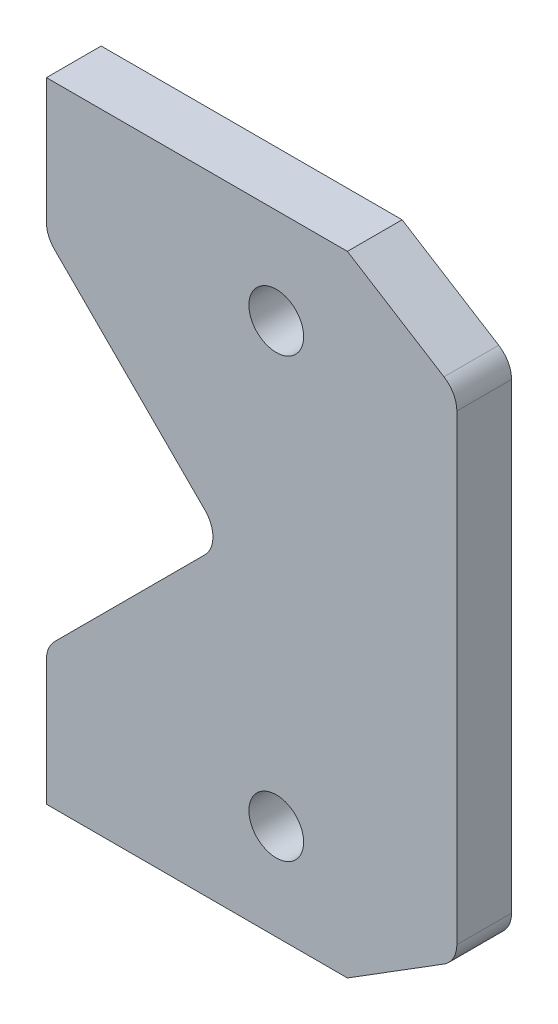
ISO-10303-21;
HEADER;
FILE_DESCRIPTION(('STEP AP214'),'2;1');
FILE_NAME('part.step','',(''),(''),'','','');
FILE_SCHEMA(('AUTOMOTIVE_DESIGN { 1 0 10303 214 1 1 1 1 }'));
ENDSEC;
DATA;
#1=APPLICATION_CONTEXT('core data for automotive mechanical design processes');
#2=APPLICATION_PROTOCOL_DEFINITION('international standard','automotive_design',2000,#1);
#3=PRODUCT_CONTEXT('',#1,'mechanical');
#4=PRODUCT('Part','Part','',(#3));
#5=PRODUCT_RELATED_PRODUCT_CATEGORY('part','',(#4));
#6=PRODUCT_DEFINITION_FORMATION('','',#4);
#7=PRODUCT_DEFINITION_CONTEXT('part definition',#1,'design');
#8=PRODUCT_DEFINITION('design','',#6,#7);
#9=PRODUCT_DEFINITION_SHAPE('','',#8);
#10=(LENGTH_UNIT() NAMED_UNIT(*) SI_UNIT(.MILLI.,.METRE.));
#11=(NAMED_UNIT(*) PLANE_ANGLE_UNIT() SI_UNIT($,.RADIAN.));
#12=(NAMED_UNIT(*) SI_UNIT($,.STERADIAN.) SOLID_ANGLE_UNIT());
#13=UNCERTAINTY_MEASURE_WITH_UNIT(LENGTH_MEASURE(1.E-05),#10,'distance_accuracy_value','');
#14=(GEOMETRIC_REPRESENTATION_CONTEXT(3) GLOBAL_UNCERTAINTY_ASSIGNED_CONTEXT((#13)) GLOBAL_UNIT_ASSIGNED_CONTEXT((#10,
#11,#12)) REPRESENTATION_CONTEXT('',''));
#15=CARTESIAN_POINT('',(0.,0.,0.));
#16=DIRECTION('',(0.,0.,1.));
#17=DIRECTION('',(1.,0.,0.));
#18=AXIS2_PLACEMENT_3D('',#15,#16,#17);
#19=CARTESIAN_POINT('',(0.,0.,10.));
#20=DIRECTION('',(0.,0.,1.));
#21=DIRECTION('',(1.,0.,0.));
#22=AXIS2_PLACEMENT_3D('',#19,#20,#21);
#23=PLANE('',#22);
#24=CARTESIAN_POINT('',(4.5,40.,10.));
#25=DIRECTION('',(0.,0.,1.));
#26=DIRECTION('',(1.,0.,0.));
#27=AXIS2_PLACEMENT_3D('',#24,#25,#26);
#28=CIRCLE('',#27,5.);
#29=CARTESIAN_POINT('',(9.50000000000001,40.,10.));
#30=VERTEX_POINT('',#29);
#31=EDGE_CURVE('E313',#30,#30,#28,.T.);
#32=ORIENTED_EDGE('',*,*,#31,.F.);
#33=EDGE_LOOP('',(#32));
#34=FACE_BOUND('',#33,.T.);
#35=DIRECTION('',(0.847998304005088,0.52999894000318,0.));
#36=VECTOR('',#35,1.);
#37=CARTESIAN_POINT('',(30.7584269662921,-49.2134831460674,10.));
#38=LINE('',#37,#36);
#39=CARTESIAN_POINT('',(17.5,-57.5,10.));
#40=VERTEX_POINT('',#39);
#41=CARTESIAN_POINT('',(35.1499947000159,-46.4687533124901,10.));
#42=VERTEX_POINT('',#41);
#43=EDGE_CURVE('E159',#40,#42,#38,.T.);
#44=ORIENTED_EDGE('',*,*,#43,.T.);
#45=CARTESIAN_POINT('',(32.5,-42.2287617924646,10.));
#46=DIRECTION('',(0.,0.,1.));
#47=DIRECTION('',(1.,0.,0.));
#48=AXIS2_PLACEMENT_3D('',#45,#46,#47);
#49=CIRCLE('',#48,5.);
#50=CARTESIAN_POINT('',(37.5,-42.2287617924646,10.));
#51=VERTEX_POINT('',#50);
#52=EDGE_CURVE('E226',#42,#51,#49,.T.);
#53=ORIENTED_EDGE('',*,*,#52,.T.);
#54=DIRECTION('',(0.,-1.,0.));
#55=VECTOR('',#54,1.);
#56=CARTESIAN_POINT('',(37.5,0.,10.));
#57=LINE('',#56,#55);
#58=CARTESIAN_POINT('',(37.5,42.2287617924646,10.));
#59=VERTEX_POINT('',#58);
#60=EDGE_CURVE('E248',#59,#51,#57,.T.);
#61=ORIENTED_EDGE('',*,*,#60,.F.);
#62=CARTESIAN_POINT('',(32.5,42.2287617924646,10.));
#63=DIRECTION('',(0.,0.,1.));
#64=DIRECTION('',(1.,0.,0.));
#65=AXIS2_PLACEMENT_3D('',#62,#63,#64);
#66=CIRCLE('',#65,5.);
#67=CARTESIAN_POINT('',(35.1499947000159,46.4687533124901,10.));
#68=VERTEX_POINT('',#67);
#69=EDGE_CURVE('E224',#59,#68,#66,.T.);
#70=ORIENTED_EDGE('',*,*,#69,.T.);
#71=DIRECTION('',(0.847998304005088,-0.52999894000318,0.));
#72=VECTOR('',#71,1.);
#73=CARTESIAN_POINT('',(30.7584269662921,49.2134831460674,10.));
#74=LINE('',#73,#72);
#75=CARTESIAN_POINT('',(17.5,57.5,10.));
#76=VERTEX_POINT('',#75);
#77=EDGE_CURVE('E252',#76,#68,#74,.T.);
#78=ORIENTED_EDGE('',*,*,#77,.F.);
#79=DIRECTION('',(1.,0.,0.));
#80=VECTOR('',#79,1.);
#81=CARTESIAN_POINT('',(0.,57.5,10.));
#82=LINE('',#81,#80);
#83=CARTESIAN_POINT('',(-37.5,57.5,10.));
#84=VERTEX_POINT('',#83);
#85=EDGE_CURVE('E167',#84,#76,#82,.T.);
#86=ORIENTED_EDGE('',*,*,#85,.F.);
#87=DIRECTION('',(0.,-1.,0.));
#88=VECTOR('',#87,1.);
#89=CARTESIAN_POINT('',(-37.5,0.,10.));
#90=LINE('',#89,#88);
#91=CARTESIAN_POINT('',(-37.5,34.5710678118656,10.));
#92=VERTEX_POINT('',#91);
#93=EDGE_CURVE('E267',#84,#92,#90,.T.);
#94=ORIENTED_EDGE('',*,*,#93,.T.);
#95=CARTESIAN_POINT('',(-32.5,34.5710678118656,10.));
#96=DIRECTION('',(0.,0.,1.));
#97=DIRECTION('',(1.,0.,0.));
#98=AXIS2_PLACEMENT_3D('',#95,#96,#97);
#99=CIRCLE('',#98,5.);
#100=CARTESIAN_POINT('',(-36.0355339059326,31.0355339059327,10.));
#101=VERTEX_POINT('',#100);
#102=EDGE_CURVE('E206',#92,#101,#99,.T.);
#103=ORIENTED_EDGE('',*,*,#102,.T.);
#104=DIRECTION('',(0.707106781186578,-0.707106781186517,0.));
#105=VECTOR('',#104,1.);
#106=CARTESIAN_POINT('',(-2.49999999999839,-2.4999999999986,10.));
#107=LINE('',#106,#105);
#108=CARTESIAN_POINT('',(-8.53553390592969,3.53553390593217,10.));
#109=VERTEX_POINT('',#108);
#110=EDGE_CURVE('E191',#101,#109,#107,.T.);
#111=ORIENTED_EDGE('',*,*,#110,.T.);
#112=CARTESIAN_POINT('',(-12.0710678118623,-7.13838710364456E-13,10.));
#113=DIRECTION('',(0.,0.,1.));
#114=DIRECTION('',(1.,0.,0.));
#115=AXIS2_PLACEMENT_3D('',#112,#113,#114);
#116=CIRCLE('',#115,5.);
#117=CARTESIAN_POINT('',(-8.53553390592978,-3.53553390593369,10.));
#118=VERTEX_POINT('',#117);
#119=EDGE_CURVE('E219',#109,#118,#116,.F.);
#120=ORIENTED_EDGE('',*,*,#119,.T.);
#121=DIRECTION('',(0.707106781186595,0.7071067811865,0.));
#122=VECTOR('',#121,1.);
#123=CARTESIAN_POINT('',(-2.49999999999746,2.4999999999978,10.));
#124=LINE('',#123,#122);
#125=CARTESIAN_POINT('',(-36.0355339059325,-31.0355339059327,10.));
#126=VERTEX_POINT('',#125);
#127=EDGE_CURVE('E187',#126,#118,#124,.T.);
#128=ORIENTED_EDGE('',*,*,#127,.F.);
#129=CARTESIAN_POINT('',(-32.5,-34.5710678118657,10.));
#130=DIRECTION('',(0.,0.,1.));
#131=DIRECTION('',(1.,0.,0.));
#132=AXIS2_PLACEMENT_3D('',#129,#130,#131);
#133=CIRCLE('',#132,5.);
#134=CARTESIAN_POINT('',(-37.5,-34.5710678118657,10.));
#135=VERTEX_POINT('',#134);
#136=EDGE_CURVE('E208',#126,#135,#133,.T.);
#137=ORIENTED_EDGE('',*,*,#136,.T.);
#138=DIRECTION('',(0.,-1.,0.));
#139=VECTOR('',#138,1.);
#140=CARTESIAN_POINT('',(-37.5,0.,10.));
#141=LINE('',#140,#139);
#142=CARTESIAN_POINT('',(-37.5,-57.5,10.));
#143=VERTEX_POINT('',#142);
#144=EDGE_CURVE('E262',#135,#143,#141,.T.);
#145=ORIENTED_EDGE('',*,*,#144,.T.);
#146=DIRECTION('',(1.,0.,0.));
#147=VECTOR('',#146,1.);
#148=CARTESIAN_POINT('',(0.,-57.5,10.));
#149=LINE('',#148,#147);
#150=EDGE_CURVE('E264',#143,#40,#149,.T.);
#151=ORIENTED_EDGE('',*,*,#150,.T.);
#152=EDGE_LOOP('',(#44,#53,#61,#70,#78,#86,#94,#103,#111,#120,#128,#137,#145,#151));
#153=FACE_BOUND('',#152,.T.);
#154=CARTESIAN_POINT('',(4.5,-40.,10.));
#155=DIRECTION('',(0.,0.,1.));
#156=DIRECTION('',(1.,0.,0.));
#157=AXIS2_PLACEMENT_3D('',#154,#155,#156);
#158=CIRCLE('',#157,5.);
#159=CARTESIAN_POINT('',(9.50000000000001,-40.,10.));
#160=VERTEX_POINT('',#159);
#161=EDGE_CURVE('E316',#160,#160,#158,.F.);
#162=ORIENTED_EDGE('',*,*,#161,.T.);
#163=EDGE_LOOP('',(#162));
#164=FACE_BOUND('',#163,.T.);
#165=ADVANCED_FACE('F51',(#34,#153,#164),#23,.T.);
#166=CARTESIAN_POINT('',(0.,0.,0.));
#167=DIRECTION('',(0.,0.,1.));
#168=DIRECTION('',(1.,0.,0.));
#169=AXIS2_PLACEMENT_3D('',#166,#167,#168);
#170=PLANE('',#169);
#171=CARTESIAN_POINT('',(4.5,40.,0.));
#172=DIRECTION('',(0.,0.,1.));
#173=DIRECTION('',(1.,0.,0.));
#174=AXIS2_PLACEMENT_3D('',#171,#172,#173);
#175=CIRCLE('',#174,5.);
#176=CARTESIAN_POINT('',(9.50000000000001,40.,0.));
#177=VERTEX_POINT('',#176);
#178=EDGE_CURVE('E310',#177,#177,#175,.T.);
#179=ORIENTED_EDGE('',*,*,#178,.T.);
#180=EDGE_LOOP('',(#179));
#181=FACE_BOUND('',#180,.T.);
#182=DIRECTION('',(0.,-1.,0.));
#183=VECTOR('',#182,1.);
#184=CARTESIAN_POINT('',(37.5,0.,0.));
#185=LINE('',#184,#183);
#186=CARTESIAN_POINT('',(37.5,42.2287617924646,0.));
#187=VERTEX_POINT('',#186);
#188=CARTESIAN_POINT('',(37.5,-42.2287617924646,0.));
#189=VERTEX_POINT('',#188);
#190=EDGE_CURVE('E158',#187,#189,#185,.T.);
#191=ORIENTED_EDGE('',*,*,#190,.T.);
#192=CARTESIAN_POINT('',(32.5,-42.2287617924646,0.));
#193=DIRECTION('',(0.,0.,1.));
#194=DIRECTION('',(1.,0.,0.));
#195=AXIS2_PLACEMENT_3D('',#192,#193,#194);
#196=CIRCLE('',#195,5.);
#197=CARTESIAN_POINT('',(35.1499947000159,-46.4687533124901,0.));
#198=VERTEX_POINT('',#197);
#199=EDGE_CURVE('E59',#189,#198,#196,.F.);
#200=ORIENTED_EDGE('',*,*,#199,.T.);
#201=DIRECTION('',(0.847998304005088,0.52999894000318,0.));
#202=VECTOR('',#201,1.);
#203=CARTESIAN_POINT('',(30.7584269662921,-49.2134831460674,0.));
#204=LINE('',#203,#202);
#205=CARTESIAN_POINT('',(17.5,-57.5,0.));
#206=VERTEX_POINT('',#205);
#207=EDGE_CURVE('E169',#206,#198,#204,.T.);
#208=ORIENTED_EDGE('',*,*,#207,.F.);
#209=DIRECTION('',(1.,0.,0.));
#210=VECTOR('',#209,1.);
#211=CARTESIAN_POINT('',(0.,-57.5,0.));
#212=LINE('',#211,#210);
#213=CARTESIAN_POINT('',(-37.5,-57.5,0.));
#214=VERTEX_POINT('',#213);
#215=EDGE_CURVE('E176',#214,#206,#212,.T.);
#216=ORIENTED_EDGE('',*,*,#215,.F.);
#217=DIRECTION('',(0.,-1.,0.));
#218=VECTOR('',#217,1.);
#219=CARTESIAN_POINT('',(-37.5,0.,0.));
#220=LINE('',#219,#218);
#221=CARTESIAN_POINT('',(-37.5,-34.5710678118657,0.));
#222=VERTEX_POINT('',#221);
#223=EDGE_CURVE('E181',#222,#214,#220,.T.);
#224=ORIENTED_EDGE('',*,*,#223,.F.);
#225=CARTESIAN_POINT('',(-32.5,-34.5710678118657,0.));
#226=DIRECTION('',(0.,0.,1.));
#227=DIRECTION('',(1.,0.,0.));
#228=AXIS2_PLACEMENT_3D('',#225,#226,#227);
#229=CIRCLE('',#228,5.);
#230=CARTESIAN_POINT('',(-36.0355339059325,-31.0355339059327,0.));
#231=VERTEX_POINT('',#230);
#232=EDGE_CURVE('E199',#222,#231,#229,.F.);
#233=ORIENTED_EDGE('',*,*,#232,.T.);
#234=DIRECTION('',(0.707106781186595,0.7071067811865,0.));
#235=VECTOR('',#234,1.);
#236=CARTESIAN_POINT('',(-2.49999999999746,2.4999999999978,0.));
#237=LINE('',#236,#235);
#238=CARTESIAN_POINT('',(-8.53553390592978,-3.53553390593369,0.));
#239=VERTEX_POINT('',#238);
#240=EDGE_CURVE('E258',#231,#239,#237,.T.);
#241=ORIENTED_EDGE('',*,*,#240,.T.);
#242=CARTESIAN_POINT('',(-12.0710678118623,-7.13838710364456E-13,0.));
#243=DIRECTION('',(0.,0.,1.));
#244=DIRECTION('',(1.,0.,0.));
#245=AXIS2_PLACEMENT_3D('',#242,#243,#244);
#246=CIRCLE('',#245,5.);
#247=CARTESIAN_POINT('',(-8.53553390592969,3.53553390593217,0.));
#248=VERTEX_POINT('',#247);
#249=EDGE_CURVE('E217',#239,#248,#246,.T.);
#250=ORIENTED_EDGE('',*,*,#249,.T.);
#251=DIRECTION('',(0.707106781186578,-0.707106781186517,0.));
#252=VECTOR('',#251,1.);
#253=CARTESIAN_POINT('',(-2.49999999999839,-2.4999999999986,0.));
#254=LINE('',#253,#252);
#255=CARTESIAN_POINT('',(-36.0355339059326,31.0355339059327,0.));
#256=VERTEX_POINT('',#255);
#257=EDGE_CURVE('E178',#256,#248,#254,.T.);
#258=ORIENTED_EDGE('',*,*,#257,.F.);
#259=CARTESIAN_POINT('',(-32.5,34.5710678118656,0.));
#260=DIRECTION('',(0.,0.,1.));
#261=DIRECTION('',(1.,0.,0.));
#262=AXIS2_PLACEMENT_3D('',#259,#260,#261);
#263=CIRCLE('',#262,5.);
#264=CARTESIAN_POINT('',(-37.5,34.5710678118656,0.));
#265=VERTEX_POINT('',#264);
#266=EDGE_CURVE('E197',#256,#265,#263,.F.);
#267=ORIENTED_EDGE('',*,*,#266,.T.);
#268=DIRECTION('',(0.,-1.,0.));
#269=VECTOR('',#268,1.);
#270=CARTESIAN_POINT('',(-37.5,0.,0.));
#271=LINE('',#270,#269);
#272=CARTESIAN_POINT('',(-37.5,57.5,0.));
#273=VERTEX_POINT('',#272);
#274=EDGE_CURVE('E175',#273,#265,#271,.T.);
#275=ORIENTED_EDGE('',*,*,#274,.F.);
#276=DIRECTION('',(1.,0.,0.));
#277=VECTOR('',#276,1.);
#278=CARTESIAN_POINT('',(0.,57.5,0.));
#279=LINE('',#278,#277);
#280=CARTESIAN_POINT('',(17.5,57.5,0.));
#281=VERTEX_POINT('',#280);
#282=EDGE_CURVE('E165',#273,#281,#279,.T.);
#283=ORIENTED_EDGE('',*,*,#282,.T.);
#284=DIRECTION('',(0.847998304005088,-0.52999894000318,0.));
#285=VECTOR('',#284,1.);
#286=CARTESIAN_POINT('',(30.7584269662921,49.2134831460674,0.));
#287=LINE('',#286,#285);
#288=CARTESIAN_POINT('',(35.1499947000159,46.4687533124901,0.));
#289=VERTEX_POINT('',#288);
#290=EDGE_CURVE('E150',#281,#289,#287,.T.);
#291=ORIENTED_EDGE('',*,*,#290,.T.);
#292=CARTESIAN_POINT('',(32.5,42.2287617924646,0.));
#293=DIRECTION('',(0.,0.,1.));
#294=DIRECTION('',(1.,0.,0.));
#295=AXIS2_PLACEMENT_3D('',#292,#293,#294);
#296=CIRCLE('',#295,5.);
#297=EDGE_CURVE('E232',#289,#187,#296,.F.);
#298=ORIENTED_EDGE('',*,*,#297,.T.);
#299=EDGE_LOOP('',(#191,#200,#208,#216,#224,#233,#241,#250,#258,#267,#275,#283,#291,#298));
#300=FACE_BOUND('',#299,.T.);
#301=CARTESIAN_POINT('',(4.5,-40.,0.));
#302=DIRECTION('',(0.,0.,1.));
#303=DIRECTION('',(1.,0.,0.));
#304=AXIS2_PLACEMENT_3D('',#301,#302,#303);
#305=CIRCLE('',#304,5.);
#306=CARTESIAN_POINT('',(9.50000000000001,-40.,0.));
#307=VERTEX_POINT('',#306);
#308=EDGE_CURVE('E255',#307,#307,#305,.F.);
#309=ORIENTED_EDGE('',*,*,#308,.F.);
#310=EDGE_LOOP('',(#309));
#311=FACE_BOUND('',#310,.T.);
#312=ADVANCED_FACE('F172',(#181,#300,#311),#170,.F.);
#313=CARTESIAN_POINT('',(0.,-57.5,10.));
#314=DIRECTION('',(0.,1.,0.));
#315=DIRECTION('',(0.,0.,1.));
#316=AXIS2_PLACEMENT_3D('',#313,#314,#315);
#317=PLANE('',#316);
#318=DIRECTION('',(0.,0.,1.));
#319=VECTOR('',#318,1.);
#320=CARTESIAN_POINT('',(17.5,-57.5,0.));
#321=LINE('',#320,#319);
#322=EDGE_CURVE('E168',#206,#40,#321,.T.);
#323=ORIENTED_EDGE('',*,*,#322,.T.);
#324=ORIENTED_EDGE('',*,*,#150,.F.);
#325=DIRECTION('',(0.,0.,-1.));
#326=VECTOR('',#325,1.);
#327=CARTESIAN_POINT('',(-37.5,-57.5,10.));
#328=LINE('',#327,#326);
#329=EDGE_CURVE('E190',#143,#214,#328,.T.);
#330=ORIENTED_EDGE('',*,*,#329,.T.);
#331=ORIENTED_EDGE('',*,*,#215,.T.);
#332=EDGE_LOOP('',(#323,#324,#330,#331));
#333=FACE_BOUND('',#332,.T.);
#334=ADVANCED_FACE('F281',(#333),#317,.F.);
#335=CARTESIAN_POINT('',(-2.49999999999746,2.4999999999978,10.));
#336=DIRECTION('',(-0.7071067811865,0.707106781186595,0.));
#337=DIRECTION('',(-0.707106781186595,-0.7071067811865,0.));
#338=AXIS2_PLACEMENT_3D('',#335,#336,#337);
#339=PLANE('',#338);
#340=ORIENTED_EDGE('',*,*,#240,.F.);
#341=DIRECTION('',(0.,0.,-1.));
#342=VECTOR('',#341,1.);
#343=CARTESIAN_POINT('',(-36.0355339059325,-31.0355339059327,10.));
#344=LINE('',#343,#342);
#345=EDGE_CURVE('E204',#231,#126,#344,.F.);
#346=ORIENTED_EDGE('',*,*,#345,.T.);
#347=ORIENTED_EDGE('',*,*,#127,.T.);
#348=DIRECTION('',(0.,0.,-1.));
#349=VECTOR('',#348,1.);
#350=CARTESIAN_POINT('',(-8.53553390592977,-3.53553390593369,10.));
#351=LINE('',#350,#349);
#352=EDGE_CURVE('E201',#118,#239,#351,.T.);
#353=ORIENTED_EDGE('',*,*,#352,.T.);
#354=EDGE_LOOP('',(#340,#346,#347,#353));
#355=FACE_BOUND('',#354,.T.);
#356=ADVANCED_FACE('F289',(#355),#339,.T.);
#357=CARTESIAN_POINT('',(-37.5,0.,10.));
#358=DIRECTION('',(1.,0.,0.));
#359=DIRECTION('',(0.,0.,-1.));
#360=AXIS2_PLACEMENT_3D('',#357,#358,#359);
#361=PLANE('',#360);
#362=ORIENTED_EDGE('',*,*,#144,.F.);
#363=DIRECTION('',(0.,0.,-1.));
#364=VECTOR('',#363,1.);
#365=CARTESIAN_POINT('',(-37.5,-34.5710678118657,0.));
#366=LINE('',#365,#364);
#367=EDGE_CURVE('E194',#135,#222,#366,.T.);
#368=ORIENTED_EDGE('',*,*,#367,.T.);
#369=ORIENTED_EDGE('',*,*,#223,.T.);
#370=ORIENTED_EDGE('',*,*,#329,.F.);
#371=EDGE_LOOP('',(#362,#368,#369,#370));
#372=FACE_BOUND('',#371,.T.);
#373=ADVANCED_FACE('F277',(#372),#361,.F.);
#374=CARTESIAN_POINT('',(0.,57.5,10.));
#375=DIRECTION('',(0.,1.,0.));
#376=DIRECTION('',(0.,0.,1.));
#377=AXIS2_PLACEMENT_3D('',#374,#375,#376);
#378=PLANE('',#377);
#379=DIRECTION('',(0.,0.,1.));
#380=VECTOR('',#379,1.);
#381=CARTESIAN_POINT('',(17.5,57.5,0.));
#382=LINE('',#381,#380);
#383=EDGE_CURVE('E153',#281,#76,#382,.T.);
#384=ORIENTED_EDGE('',*,*,#383,.F.);
#385=ORIENTED_EDGE('',*,*,#282,.F.);
#386=DIRECTION('',(0.,0.,-1.));
#387=VECTOR('',#386,1.);
#388=CARTESIAN_POINT('',(-37.5,57.5,10.));
#389=LINE('',#388,#387);
#390=EDGE_CURVE('E188',#84,#273,#389,.T.);
#391=ORIENTED_EDGE('',*,*,#390,.F.);
#392=ORIENTED_EDGE('',*,*,#85,.T.);
#393=EDGE_LOOP('',(#384,#385,#391,#392));
#394=FACE_BOUND('',#393,.T.);
#395=ADVANCED_FACE('F164',(#394),#378,.T.);
#396=CARTESIAN_POINT('',(-37.5,0.,10.));
#397=DIRECTION('',(1.,0.,0.));
#398=DIRECTION('',(0.,0.,-1.));
#399=AXIS2_PLACEMENT_3D('',#396,#397,#398);
#400=PLANE('',#399);
#401=ORIENTED_EDGE('',*,*,#274,.T.);
#402=DIRECTION('',(0.,0.,-1.));
#403=VECTOR('',#402,1.);
#404=CARTESIAN_POINT('',(-37.5,34.5710678118656,10.));
#405=LINE('',#404,#403);
#406=EDGE_CURVE('E215',#265,#92,#405,.F.);
#407=ORIENTED_EDGE('',*,*,#406,.T.);
#408=ORIENTED_EDGE('',*,*,#93,.F.);
#409=ORIENTED_EDGE('',*,*,#390,.T.);
#410=EDGE_LOOP('',(#401,#407,#408,#409));
#411=FACE_BOUND('',#410,.T.);
#412=ADVANCED_FACE('F305',(#411),#400,.F.);
#413=CARTESIAN_POINT('',(-2.49999999999839,-2.4999999999986,10.));
#414=DIRECTION('',(0.707106781186517,0.707106781186578,0.));
#415=DIRECTION('',(-0.707106781186578,0.707106781186517,0.));
#416=AXIS2_PLACEMENT_3D('',#413,#414,#415);
#417=PLANE('',#416);
#418=ORIENTED_EDGE('',*,*,#257,.T.);
#419=DIRECTION('',(0.,0.,-1.));
#420=VECTOR('',#419,1.);
#421=CARTESIAN_POINT('',(-8.53553390592969,3.53553390593217,10.));
#422=LINE('',#421,#420);
#423=EDGE_CURVE('E213',#248,#109,#422,.F.);
#424=ORIENTED_EDGE('',*,*,#423,.T.);
#425=ORIENTED_EDGE('',*,*,#110,.F.);
#426=DIRECTION('',(0.,0.,-1.));
#427=VECTOR('',#426,1.);
#428=CARTESIAN_POINT('',(-36.0355339059326,31.0355339059327,10.));
#429=LINE('',#428,#427);
#430=EDGE_CURVE('E210',#101,#256,#429,.T.);
#431=ORIENTED_EDGE('',*,*,#430,.T.);
#432=EDGE_LOOP('',(#418,#424,#425,#431));
#433=FACE_BOUND('',#432,.T.);
#434=ADVANCED_FACE('F297',(#433),#417,.F.);
#435=CARTESIAN_POINT('',(-32.5,-34.5710678118657,10.));
#436=DIRECTION('',(0.,0.,1.));
#437=DIRECTION('',(1.,0.,0.));
#438=AXIS2_PLACEMENT_3D('',#435,#436,#437);
#439=CYLINDRICAL_SURFACE('',#438,5.);
#440=ORIENTED_EDGE('',*,*,#136,.F.);
#441=ORIENTED_EDGE('',*,*,#345,.F.);
#442=ORIENTED_EDGE('',*,*,#232,.F.);
#443=ORIENTED_EDGE('',*,*,#367,.F.);
#444=EDGE_LOOP('',(#440,#441,#442,#443));
#445=FACE_BOUND('',#444,.T.);
#446=ADVANCED_FACE('F285',(#445),#439,.T.);
#447=CARTESIAN_POINT('',(-12.0710678118623,-7.13838710364456E-13,10.));
#448=DIRECTION('',(0.,0.,-1.));
#449=DIRECTION('',(-1.,0.,0.));
#450=AXIS2_PLACEMENT_3D('',#447,#448,#449);
#451=CYLINDRICAL_SURFACE('',#450,5.);
#452=ORIENTED_EDGE('',*,*,#119,.F.);
#453=ORIENTED_EDGE('',*,*,#423,.F.);
#454=ORIENTED_EDGE('',*,*,#249,.F.);
#455=ORIENTED_EDGE('',*,*,#352,.F.);
#456=EDGE_LOOP('',(#452,#453,#454,#455));
#457=FACE_BOUND('',#456,.T.);
#458=ADVANCED_FACE('F293',(#457),#451,.F.);
#459=CARTESIAN_POINT('',(-32.5,34.5710678118656,10.));
#460=DIRECTION('',(0.,0.,-1.));
#461=DIRECTION('',(-1.,0.,0.));
#462=AXIS2_PLACEMENT_3D('',#459,#460,#461);
#463=CYLINDRICAL_SURFACE('',#462,5.);
#464=ORIENTED_EDGE('',*,*,#102,.F.);
#465=ORIENTED_EDGE('',*,*,#406,.F.);
#466=ORIENTED_EDGE('',*,*,#266,.F.);
#467=ORIENTED_EDGE('',*,*,#430,.F.);
#468=EDGE_LOOP('',(#464,#465,#466,#467));
#469=FACE_BOUND('',#468,.T.);
#470=ADVANCED_FACE('F302',(#469),#463,.T.);
#471=CARTESIAN_POINT('',(30.7584269662921,-49.2134831460674,0.));
#472=DIRECTION('',(0.52999894000318,-0.847998304005088,0.));
#473=DIRECTION('',(0.847998304005088,0.52999894000318,0.));
#474=AXIS2_PLACEMENT_3D('',#471,#472,#473);
#475=PLANE('',#474);
#476=ORIENTED_EDGE('',*,*,#207,.T.);
#477=DIRECTION('',(0.,0.,1.));
#478=VECTOR('',#477,1.);
#479=CARTESIAN_POINT('',(35.1499947000159,-46.4687533124901,10.));
#480=LINE('',#479,#478);
#481=EDGE_CURVE('E221',#198,#42,#480,.T.);
#482=ORIENTED_EDGE('',*,*,#481,.T.);
#483=ORIENTED_EDGE('',*,*,#43,.F.);
#484=ORIENTED_EDGE('',*,*,#322,.F.);
#485=EDGE_LOOP('',(#476,#482,#483,#484));
#486=FACE_BOUND('',#485,.T.);
#487=ADVANCED_FACE('F240',(#486),#475,.T.);
#488=CARTESIAN_POINT('',(37.5,0.,0.));
#489=DIRECTION('',(-1.,0.,0.));
#490=DIRECTION('',(0.,0.,1.));
#491=AXIS2_PLACEMENT_3D('',#488,#489,#490);
#492=PLANE('',#491);
#493=ORIENTED_EDGE('',*,*,#60,.T.);
#494=DIRECTION('',(0.,0.,1.));
#495=VECTOR('',#494,1.);
#496=CARTESIAN_POINT('',(37.5,-42.2287617924646,0.));
#497=LINE('',#496,#495);
#498=EDGE_CURVE('E72',#51,#189,#497,.F.);
#499=ORIENTED_EDGE('',*,*,#498,.T.);
#500=ORIENTED_EDGE('',*,*,#190,.F.);
#501=DIRECTION('',(0.,0.,1.));
#502=VECTOR('',#501,1.);
#503=CARTESIAN_POINT('',(37.5,42.2287617924646,0.));
#504=LINE('',#503,#502);
#505=EDGE_CURVE('E228',#187,#59,#504,.T.);
#506=ORIENTED_EDGE('',*,*,#505,.T.);
#507=EDGE_LOOP('',(#493,#499,#500,#506));
#508=FACE_BOUND('',#507,.T.);
#509=ADVANCED_FACE('F250',(#508),#492,.F.);
#510=CARTESIAN_POINT('',(30.7584269662921,49.2134831460674,0.));
#511=DIRECTION('',(-0.52999894000318,-0.847998304005088,0.));
#512=DIRECTION('',(0.847998304005088,-0.52999894000318,0.));
#513=AXIS2_PLACEMENT_3D('',#510,#511,#512);
#514=PLANE('',#513);
#515=ORIENTED_EDGE('',*,*,#77,.T.);
#516=DIRECTION('',(0.,0.,1.));
#517=VECTOR('',#516,1.);
#518=CARTESIAN_POINT('',(35.1499947000159,46.4687533124901,0.));
#519=LINE('',#518,#517);
#520=EDGE_CURVE('E12',#68,#289,#519,.F.);
#521=ORIENTED_EDGE('',*,*,#520,.T.);
#522=ORIENTED_EDGE('',*,*,#290,.F.);
#523=ORIENTED_EDGE('',*,*,#383,.T.);
#524=EDGE_LOOP('',(#515,#521,#522,#523));
#525=FACE_BOUND('',#524,.T.);
#526=ADVANCED_FACE('F152',(#525),#514,.F.);
#527=CARTESIAN_POINT('',(32.5,-42.2287617924646,0.));
#528=DIRECTION('',(0.,0.,-1.));
#529=DIRECTION('',(-1.,0.,0.));
#530=AXIS2_PLACEMENT_3D('',#527,#528,#529);
#531=CYLINDRICAL_SURFACE('',#530,5.);
#532=ORIENTED_EDGE('',*,*,#199,.F.);
#533=ORIENTED_EDGE('',*,*,#498,.F.);
#534=ORIENTED_EDGE('',*,*,#52,.F.);
#535=ORIENTED_EDGE('',*,*,#481,.F.);
#536=EDGE_LOOP('',(#532,#533,#534,#535));
#537=FACE_BOUND('',#536,.T.);
#538=ADVANCED_FACE('F244',(#537),#531,.T.);
#539=CARTESIAN_POINT('',(32.5,42.2287617924646,0.));
#540=DIRECTION('',(0.,0.,1.));
#541=DIRECTION('',(1.,0.,0.));
#542=AXIS2_PLACEMENT_3D('',#539,#540,#541);
#543=CYLINDRICAL_SURFACE('',#542,5.);
#544=ORIENTED_EDGE('',*,*,#297,.F.);
#545=ORIENTED_EDGE('',*,*,#520,.F.);
#546=ORIENTED_EDGE('',*,*,#69,.F.);
#547=ORIENTED_EDGE('',*,*,#505,.F.);
#548=EDGE_LOOP('',(#544,#545,#546,#547));
#549=FACE_BOUND('',#548,.T.);
#550=ADVANCED_FACE('F53',(#549),#543,.T.);
#551=CARTESIAN_POINT('',(4.5,-40.,0.));
#552=DIRECTION('',(0.,0.,1.));
#553=DIRECTION('',(1.,0.,0.));
#554=AXIS2_PLACEMENT_3D('',#551,#552,#553);
#555=CYLINDRICAL_SURFACE('',#554,5.);
#556=ORIENTED_EDGE('',*,*,#161,.F.);
#557=EDGE_LOOP('',(#556));
#558=FACE_BOUND('',#557,.T.);
#559=ORIENTED_EDGE('',*,*,#308,.T.);
#560=EDGE_LOOP('',(#559));
#561=FACE_BOUND('',#560,.T.);
#562=ADVANCED_FACE('F322',(#558,#561),#555,.F.);
#563=CARTESIAN_POINT('',(4.5,40.,0.));
#564=DIRECTION('',(0.,0.,1.));
#565=DIRECTION('',(1.,0.,0.));
#566=AXIS2_PLACEMENT_3D('',#563,#564,#565);
#567=CYLINDRICAL_SURFACE('',#566,5.);
#568=ORIENTED_EDGE('',*,*,#31,.T.);
#569=EDGE_LOOP('',(#568));
#570=FACE_BOUND('',#569,.T.);
#571=ORIENTED_EDGE('',*,*,#178,.F.);
#572=EDGE_LOOP('',(#571));
#573=FACE_BOUND('',#572,.T.);
#574=ADVANCED_FACE('F362',(#570,#573),#567,.F.);
#575=CLOSED_SHELL('',(#165,#312,#334,#356,#373,#395,#412,#434,#446,#458,#470,#487,#509,#526,
#538,#550,#562,#574));
#576=MANIFOLD_SOLID_BREP('B2',#575);
#577=ADVANCED_BREP_SHAPE_REPRESENTATION('',(#18,#576),#14);
#578=SHAPE_DEFINITION_REPRESENTATION(#9,#577);
ENDSEC;
END-ISO-10303-21;
